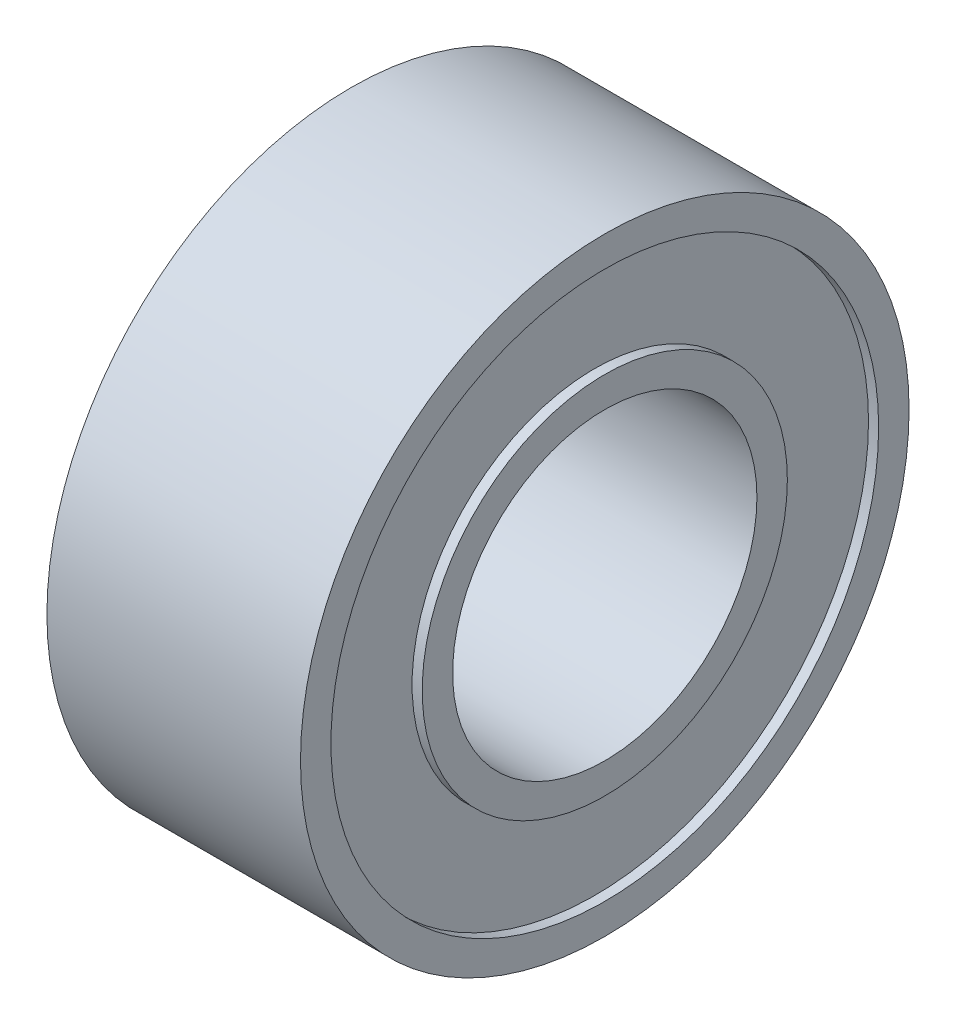
ISO-10303-21;
HEADER;
FILE_DESCRIPTION(('STEP AP214'),'2;1');
FILE_NAME('part.step','',(''),(''),'','','');
FILE_SCHEMA(('AUTOMOTIVE_DESIGN { 1 0 10303 214 1 1 1 1 }'));
ENDSEC;
DATA;
#1=APPLICATION_CONTEXT('core data for automotive mechanical design processes');
#2=APPLICATION_PROTOCOL_DEFINITION('international standard','automotive_design',2000,#1);
#3=PRODUCT_CONTEXT('',#1,'mechanical');
#4=PRODUCT('Part','Part','',(#3));
#5=PRODUCT_RELATED_PRODUCT_CATEGORY('part','',(#4));
#6=PRODUCT_DEFINITION_FORMATION('','',#4);
#7=PRODUCT_DEFINITION_CONTEXT('part definition',#1,'design');
#8=PRODUCT_DEFINITION('design','',#6,#7);
#9=PRODUCT_DEFINITION_SHAPE('','',#8);
#10=(LENGTH_UNIT() NAMED_UNIT(*) SI_UNIT(.MILLI.,.METRE.));
#11=(NAMED_UNIT(*) PLANE_ANGLE_UNIT() SI_UNIT($,.RADIAN.));
#12=(NAMED_UNIT(*) SI_UNIT($,.STERADIAN.) SOLID_ANGLE_UNIT());
#13=UNCERTAINTY_MEASURE_WITH_UNIT(LENGTH_MEASURE(1.E-05),#10,'distance_accuracy_value','');
#14=(GEOMETRIC_REPRESENTATION_CONTEXT(3) GLOBAL_UNCERTAINTY_ASSIGNED_CONTEXT((#13)) GLOBAL_UNIT_ASSIGNED_CONTEXT((#10,
#11,#12)) REPRESENTATION_CONTEXT('',''));
#15=CARTESIAN_POINT('',(0.,0.,0.));
#16=DIRECTION('',(0.,0.,1.));
#17=DIRECTION('',(1.,0.,0.));
#18=AXIS2_PLACEMENT_3D('',#15,#16,#17);
#19=CARTESIAN_POINT('',(1.25,0.,0.));
#20=DIRECTION('',(-1.,0.,0.));
#21=DIRECTION('',(0.,0.,1.));
#22=AXIS2_PLACEMENT_3D('',#19,#20,#21);
#23=CYLINDRICAL_SURFACE('',#22,2.7);
#24=CARTESIAN_POINT('',(-1.25,0.,0.));
#25=DIRECTION('',(1.,0.,0.));
#26=DIRECTION('',(0.,0.,-1.));
#27=AXIS2_PLACEMENT_3D('',#24,#25,#26);
#28=CIRCLE('',#27,2.7);
#29=CARTESIAN_POINT('',(-1.25,0.,-2.7));
#30=VERTEX_POINT('',#29);
#31=EDGE_CURVE('E59',#30,#30,#28,.T.);
#32=ORIENTED_EDGE('',*,*,#31,.F.);
#33=EDGE_LOOP('',(#32));
#34=FACE_BOUND('',#33,.T.);
#35=CARTESIAN_POINT('',(-1.15,0.,0.));
#36=DIRECTION('',(1.,0.,0.));
#37=DIRECTION('',(0.,0.,-1.));
#38=AXIS2_PLACEMENT_3D('',#35,#36,#37);
#39=CIRCLE('',#38,2.7);
#40=CARTESIAN_POINT('',(-1.15,0.,-2.7));
#41=VERTEX_POINT('',#40);
#42=EDGE_CURVE('E61',#41,#41,#39,.T.);
#43=ORIENTED_EDGE('',*,*,#42,.T.);
#44=EDGE_LOOP('',(#43));
#45=FACE_BOUND('',#44,.T.);
#46=ADVANCED_FACE('F39',(#34,#45),#23,.F.);
#47=CARTESIAN_POINT('',(1.15,0.,0.));
#48=DIRECTION('',(1.,0.,0.));
#49=DIRECTION('',(0.,0.,-1.));
#50=AXIS2_PLACEMENT_3D('',#47,#48,#49);
#51=CIRCLE('',#50,2.7);
#52=CARTESIAN_POINT('',(1.15,0.,-2.7));
#53=VERTEX_POINT('',#52);
#54=EDGE_CURVE('E11',#53,#53,#51,.T.);
#55=ORIENTED_EDGE('',*,*,#54,.F.);
#56=EDGE_LOOP('',(#55));
#57=FACE_BOUND('',#56,.T.);
#58=CARTESIAN_POINT('',(1.25,0.,0.));
#59=DIRECTION('',(1.,0.,0.));
#60=DIRECTION('',(0.,0.,-1.));
#61=AXIS2_PLACEMENT_3D('',#58,#59,#60);
#62=CIRCLE('',#61,2.7);
#63=CARTESIAN_POINT('',(1.25,0.,-2.7));
#64=VERTEX_POINT('',#63);
#65=EDGE_CURVE('E50',#64,#64,#62,.T.);
#66=ORIENTED_EDGE('',*,*,#65,.T.);
#67=EDGE_LOOP('',(#66));
#68=FACE_BOUND('',#67,.T.);
#69=ADVANCED_FACE('F41',(#57,#68),#23,.F.);
#70=CARTESIAN_POINT('',(1.25,0.,0.));
#71=DIRECTION('',(-1.,0.,0.));
#72=DIRECTION('',(0.,0.,1.));
#73=AXIS2_PLACEMENT_3D('',#70,#71,#72);
#74=CYLINDRICAL_SURFACE('',#73,3.);
#75=CARTESIAN_POINT('',(1.25,0.,0.));
#76=DIRECTION('',(1.,0.,0.));
#77=DIRECTION('',(0.,0.,-1.));
#78=AXIS2_PLACEMENT_3D('',#75,#76,#77);
#79=CIRCLE('',#78,3.);
#80=CARTESIAN_POINT('',(1.25,0.,-3.));
#81=VERTEX_POINT('',#80);
#82=EDGE_CURVE('E46',#81,#81,#79,.T.);
#83=ORIENTED_EDGE('',*,*,#82,.F.);
#84=EDGE_LOOP('',(#83));
#85=FACE_BOUND('',#84,.T.);
#86=CARTESIAN_POINT('',(-1.25,0.,0.));
#87=DIRECTION('',(1.,0.,0.));
#88=DIRECTION('',(0.,0.,-1.));
#89=AXIS2_PLACEMENT_3D('',#86,#87,#88);
#90=CIRCLE('',#89,3.);
#91=CARTESIAN_POINT('',(-1.25,0.,-3.));
#92=VERTEX_POINT('',#91);
#93=EDGE_CURVE('E55',#92,#92,#90,.T.);
#94=ORIENTED_EDGE('',*,*,#93,.T.);
#95=EDGE_LOOP('',(#94));
#96=FACE_BOUND('',#95,.T.);
#97=ADVANCED_FACE('F65',(#85,#96),#74,.T.);
#98=CARTESIAN_POINT('',(1.25,0.,0.));
#99=DIRECTION('',(1.,0.,0.));
#100=DIRECTION('',(0.,0.,-1.));
#101=AXIS2_PLACEMENT_3D('',#98,#99,#100);
#102=PLANE('',#101);
#103=ORIENTED_EDGE('',*,*,#65,.F.);
#104=EDGE_LOOP('',(#103));
#105=FACE_BOUND('',#104,.T.);
#106=ORIENTED_EDGE('',*,*,#82,.T.);
#107=EDGE_LOOP('',(#106));
#108=FACE_BOUND('',#107,.T.);
#109=ADVANCED_FACE('F70',(#105,#108),#102,.T.);
#110=CARTESIAN_POINT('',(-1.25,0.,0.));
#111=DIRECTION('',(1.,0.,0.));
#112=DIRECTION('',(0.,0.,-1.));
#113=AXIS2_PLACEMENT_3D('',#110,#111,#112);
#114=PLANE('',#113);
#115=ORIENTED_EDGE('',*,*,#31,.T.);
#116=EDGE_LOOP('',(#115));
#117=FACE_BOUND('',#116,.T.);
#118=ORIENTED_EDGE('',*,*,#93,.F.);
#119=EDGE_LOOP('',(#118));
#120=FACE_BOUND('',#119,.T.);
#121=ADVANCED_FACE('F67',(#117,#120),#114,.F.);
#122=CARTESIAN_POINT('',(1.15,0.,0.));
#123=DIRECTION('',(1.,0.,0.));
#124=DIRECTION('',(0.,0.,-1.));
#125=AXIS2_PLACEMENT_3D('',#122,#123,#124);
#126=PLANE('',#125);
#127=ORIENTED_EDGE('',*,*,#54,.T.);
#128=EDGE_LOOP('',(#127));
#129=FACE_BOUND('',#128,.T.);
#130=CARTESIAN_POINT('',(1.15,0.,0.));
#131=DIRECTION('',(1.,0.,0.));
#132=DIRECTION('',(0.,0.,-1.));
#133=AXIS2_PLACEMENT_3D('',#130,#131,#132);
#134=CIRCLE('',#133,1.8);
#135=CARTESIAN_POINT('',(1.15,0.,-1.8));
#136=VERTEX_POINT('',#135);
#137=EDGE_CURVE('E92',#136,#136,#134,.T.);
#138=ORIENTED_EDGE('',*,*,#137,.F.);
#139=EDGE_LOOP('',(#138));
#140=FACE_BOUND('',#139,.T.);
#141=ADVANCED_FACE('F69',(#129,#140),#126,.T.);
#142=CARTESIAN_POINT('',(-1.15,0.,0.));
#143=DIRECTION('',(1.,0.,0.));
#144=DIRECTION('',(0.,0.,-1.));
#145=AXIS2_PLACEMENT_3D('',#142,#143,#144);
#146=PLANE('',#145);
#147=ORIENTED_EDGE('',*,*,#42,.F.);
#148=EDGE_LOOP('',(#147));
#149=FACE_BOUND('',#148,.T.);
#150=CARTESIAN_POINT('',(-1.15,0.,0.));
#151=DIRECTION('',(1.,0.,0.));
#152=DIRECTION('',(0.,0.,-1.));
#153=AXIS2_PLACEMENT_3D('',#150,#151,#152);
#154=CIRCLE('',#153,1.8);
#155=CARTESIAN_POINT('',(-1.15,0.,-1.8));
#156=VERTEX_POINT('',#155);
#157=EDGE_CURVE('E94',#156,#156,#154,.F.);
#158=ORIENTED_EDGE('',*,*,#157,.F.);
#159=EDGE_LOOP('',(#158));
#160=FACE_BOUND('',#159,.T.);
#161=ADVANCED_FACE('F77',(#149,#160),#146,.F.);
#162=CARTESIAN_POINT('',(1.25,0.,0.));
#163=DIRECTION('',(-1.,0.,0.));
#164=DIRECTION('',(0.,0.,1.));
#165=AXIS2_PLACEMENT_3D('',#162,#163,#164);
#166=CYLINDRICAL_SURFACE('',#165,1.8);
#167=CARTESIAN_POINT('',(-1.25,0.,0.));
#168=DIRECTION('',(1.,0.,0.));
#169=DIRECTION('',(0.,0.,-1.));
#170=AXIS2_PLACEMENT_3D('',#167,#168,#169);
#171=CIRCLE('',#170,1.8);
#172=CARTESIAN_POINT('',(-1.25,0.,-1.8));
#173=VERTEX_POINT('',#172);
#174=EDGE_CURVE('E100',#173,#173,#171,.T.);
#175=ORIENTED_EDGE('',*,*,#174,.T.);
#176=EDGE_LOOP('',(#175));
#177=FACE_BOUND('',#176,.T.);
#178=ORIENTED_EDGE('',*,*,#157,.T.);
#179=EDGE_LOOP('',(#178));
#180=FACE_BOUND('',#179,.T.);
#181=ADVANCED_FACE('F126',(#177,#180),#166,.T.);
#182=CARTESIAN_POINT('',(1.25,0.,0.));
#183=DIRECTION('',(-1.,0.,0.));
#184=DIRECTION('',(0.,0.,1.));
#185=AXIS2_PLACEMENT_3D('',#182,#183,#184);
#186=CYLINDRICAL_SURFACE('',#185,1.5);
#187=CARTESIAN_POINT('',(1.25,0.,0.));
#188=DIRECTION('',(1.,0.,0.));
#189=DIRECTION('',(0.,0.,-1.));
#190=AXIS2_PLACEMENT_3D('',#187,#188,#189);
#191=CIRCLE('',#190,1.5);
#192=CARTESIAN_POINT('',(1.25,0.,-1.5));
#193=VERTEX_POINT('',#192);
#194=EDGE_CURVE('E103',#193,#193,#191,.T.);
#195=ORIENTED_EDGE('',*,*,#194,.T.);
#196=EDGE_LOOP('',(#195));
#197=FACE_BOUND('',#196,.T.);
#198=CARTESIAN_POINT('',(-1.25,0.,0.));
#199=DIRECTION('',(1.,0.,0.));
#200=DIRECTION('',(0.,0.,-1.));
#201=AXIS2_PLACEMENT_3D('',#198,#199,#200);
#202=CIRCLE('',#201,1.5);
#203=CARTESIAN_POINT('',(-1.25,0.,-1.5));
#204=VERTEX_POINT('',#203);
#205=EDGE_CURVE('E104',#204,#204,#202,.T.);
#206=ORIENTED_EDGE('',*,*,#205,.F.);
#207=EDGE_LOOP('',(#206));
#208=FACE_BOUND('',#207,.T.);
#209=ADVANCED_FACE('F112',(#197,#208),#186,.F.);
#210=ORIENTED_EDGE('',*,*,#137,.T.);
#211=EDGE_LOOP('',(#210));
#212=FACE_BOUND('',#211,.T.);
#213=CARTESIAN_POINT('',(1.25,0.,0.));
#214=DIRECTION('',(1.,0.,0.));
#215=DIRECTION('',(0.,0.,-1.));
#216=AXIS2_PLACEMENT_3D('',#213,#214,#215);
#217=CIRCLE('',#216,1.8);
#218=CARTESIAN_POINT('',(1.25,0.,-1.8));
#219=VERTEX_POINT('',#218);
#220=EDGE_CURVE('E99',#219,#219,#217,.T.);
#221=ORIENTED_EDGE('',*,*,#220,.F.);
#222=EDGE_LOOP('',(#221));
#223=FACE_BOUND('',#222,.T.);
#224=ADVANCED_FACE('F119',(#212,#223),#166,.T.);
#225=CARTESIAN_POINT('',(1.25,0.,0.));
#226=DIRECTION('',(1.,0.,0.));
#227=DIRECTION('',(0.,0.,-1.));
#228=AXIS2_PLACEMENT_3D('',#225,#226,#227);
#229=PLANE('',#228);
#230=ORIENTED_EDGE('',*,*,#194,.F.);
#231=EDGE_LOOP('',(#230));
#232=FACE_BOUND('',#231,.T.);
#233=ORIENTED_EDGE('',*,*,#220,.T.);
#234=EDGE_LOOP('',(#233));
#235=FACE_BOUND('',#234,.T.);
#236=ADVANCED_FACE('F115',(#232,#235),#229,.T.);
#237=CARTESIAN_POINT('',(-1.25,0.,0.));
#238=DIRECTION('',(1.,0.,0.));
#239=DIRECTION('',(0.,0.,-1.));
#240=AXIS2_PLACEMENT_3D('',#237,#238,#239);
#241=PLANE('',#240);
#242=ORIENTED_EDGE('',*,*,#205,.T.);
#243=EDGE_LOOP('',(#242));
#244=FACE_BOUND('',#243,.T.);
#245=ORIENTED_EDGE('',*,*,#174,.F.);
#246=EDGE_LOOP('',(#245));
#247=FACE_BOUND('',#246,.T.);
#248=ADVANCED_FACE('F118',(#244,#247),#241,.F.);
#249=CLOSED_SHELL('',(#46,#69,#97,#109,#121,#141,#161,#181,#209,#224,#236,#248));
#250=MANIFOLD_SOLID_BREP('B2',#249);
#251=ADVANCED_BREP_SHAPE_REPRESENTATION('',(#18,#250),#14);
#252=SHAPE_DEFINITION_REPRESENTATION(#9,#251);
ENDSEC;
END-ISO-10303-21;
